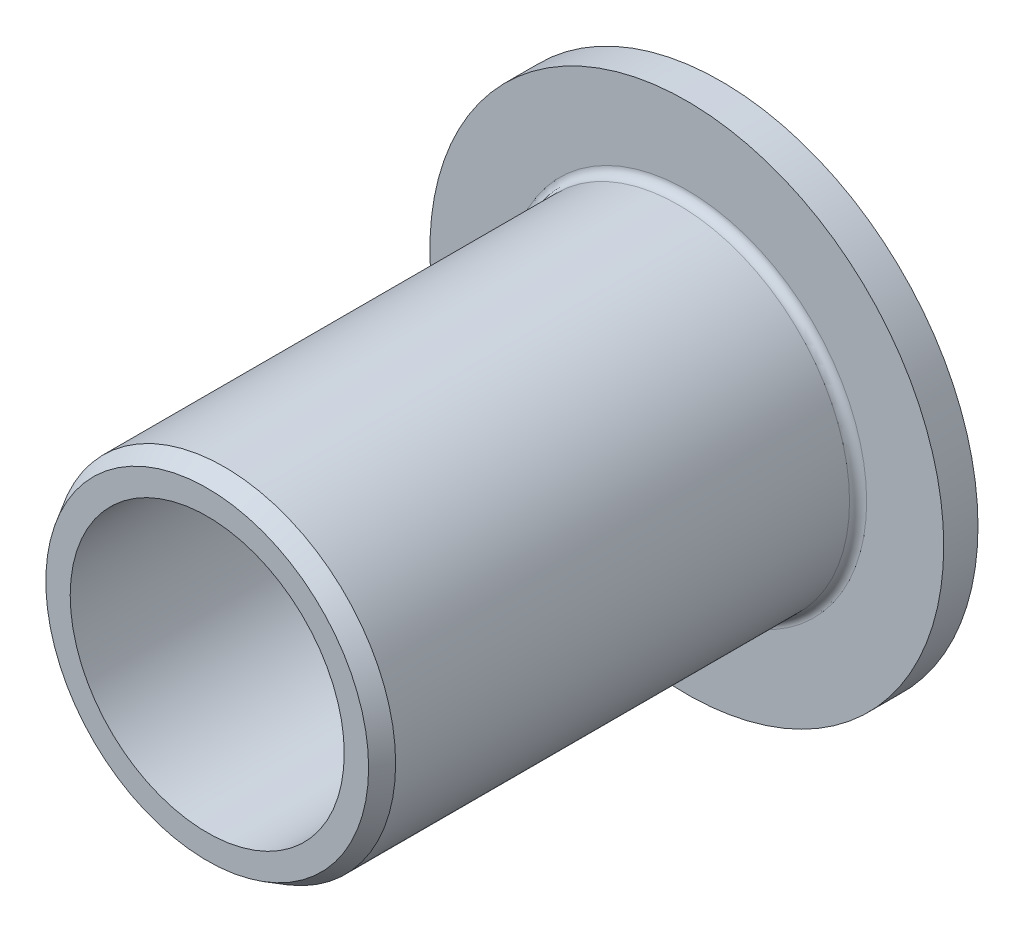
ISO-10303-21;
HEADER;
FILE_DESCRIPTION(('STEP AP214'),'2;1');
FILE_NAME('part.step','',(''),(''),'','','');
FILE_SCHEMA(('AUTOMOTIVE_DESIGN { 1 0 10303 214 1 1 1 1 }'));
ENDSEC;
DATA;
#1=APPLICATION_CONTEXT('core data for automotive mechanical design processes');
#2=APPLICATION_PROTOCOL_DEFINITION('international standard','automotive_design',2000,#1);
#3=PRODUCT_CONTEXT('',#1,'mechanical');
#4=PRODUCT('Part','Part','',(#3));
#5=PRODUCT_RELATED_PRODUCT_CATEGORY('part','',(#4));
#6=PRODUCT_DEFINITION_FORMATION('','',#4);
#7=PRODUCT_DEFINITION_CONTEXT('part definition',#1,'design');
#8=PRODUCT_DEFINITION('design','',#6,#7);
#9=PRODUCT_DEFINITION_SHAPE('','',#8);
#10=(LENGTH_UNIT() NAMED_UNIT(*) SI_UNIT(.MILLI.,.METRE.));
#11=(NAMED_UNIT(*) PLANE_ANGLE_UNIT() SI_UNIT($,.RADIAN.));
#12=(NAMED_UNIT(*) SI_UNIT($,.STERADIAN.) SOLID_ANGLE_UNIT());
#13=UNCERTAINTY_MEASURE_WITH_UNIT(LENGTH_MEASURE(1.E-05),#10,'distance_accuracy_value','');
#14=(GEOMETRIC_REPRESENTATION_CONTEXT(3) GLOBAL_UNCERTAINTY_ASSIGNED_CONTEXT((#13)) GLOBAL_UNIT_ASSIGNED_CONTEXT((#10,
#11,#12)) REPRESENTATION_CONTEXT('',''));
#15=CARTESIAN_POINT('',(0.,0.,0.));
#16=DIRECTION('',(0.,0.,1.));
#17=DIRECTION('',(1.,0.,0.));
#18=AXIS2_PLACEMENT_3D('',#15,#16,#17);
#19=CARTESIAN_POINT('',(0.,0.,0.));
#20=DIRECTION('',(0.,0.,1.));
#21=DIRECTION('',(1.,0.,0.));
#22=AXIS2_PLACEMENT_3D('',#19,#20,#21);
#23=CYLINDRICAL_SURFACE('',#22,5.);
#24=CARTESIAN_POINT('',(0.,0.,1.25));
#25=DIRECTION('',(0.,0.,1.));
#26=DIRECTION('',(1.,0.,0.));
#27=AXIS2_PLACEMENT_3D('',#24,#25,#26);
#28=CIRCLE('',#27,5.);
#29=CARTESIAN_POINT('',(5.,0.,1.25));
#30=VERTEX_POINT('',#29);
#31=EDGE_CURVE('E47',#30,#30,#28,.T.);
#32=ORIENTED_EDGE('',*,*,#31,.T.);
#33=EDGE_LOOP('',(#32));
#34=FACE_BOUND('',#33,.T.);
#35=CARTESIAN_POINT('',(0.,0.,14.4999999999993));
#36=DIRECTION('',(0.,0.,1.));
#37=DIRECTION('',(1.,0.,0.));
#38=AXIS2_PLACEMENT_3D('',#35,#36,#37);
#39=CIRCLE('',#38,5.);
#40=CARTESIAN_POINT('',(5.,0.,14.4999999999993));
#41=VERTEX_POINT('',#40);
#42=EDGE_CURVE('E51',#41,#41,#39,.T.);
#43=ORIENTED_EDGE('',*,*,#42,.F.);
#44=EDGE_LOOP('',(#43));
#45=FACE_BOUND('',#44,.T.);
#46=ADVANCED_FACE('F40',(#34,#45),#23,.T.);
#47=CARTESIAN_POINT('',(0.,0.,15.));
#48=DIRECTION('',(0.,0.,-1.));
#49=DIRECTION('',(-1.,0.,0.));
#50=AXIS2_PLACEMENT_3D('',#47,#48,#49);
#51=CONICAL_SURFACE('',#50,4.71132486540478,0.523598775598299);
#52=ORIENTED_EDGE('',*,*,#42,.T.);
#53=EDGE_LOOP('',(#52));
#54=FACE_BOUND('',#53,.T.);
#55=CARTESIAN_POINT('',(0.,0.,15.));
#56=DIRECTION('',(0.,0.,1.));
#57=DIRECTION('',(1.,0.,0.));
#58=AXIS2_PLACEMENT_3D('',#55,#56,#57);
#59=CIRCLE('',#58,4.71132486540478);
#60=CARTESIAN_POINT('',(4.71132486540478,0.,15.));
#61=VERTEX_POINT('',#60);
#62=EDGE_CURVE('E55',#61,#61,#59,.T.);
#63=ORIENTED_EDGE('',*,*,#62,.F.);
#64=EDGE_LOOP('',(#63));
#65=FACE_BOUND('',#64,.T.);
#66=ADVANCED_FACE('F89',(#54,#65),#51,.T.);
#67=CARTESIAN_POINT('',(4.,0.,15.));
#68=DIRECTION('',(0.,0.,1.));
#69=DIRECTION('',(1.,0.,0.));
#70=AXIS2_PLACEMENT_3D('',#67,#68,#69);
#71=PLANE('',#70);
#72=ORIENTED_EDGE('',*,*,#62,.T.);
#73=EDGE_LOOP('',(#72));
#74=FACE_BOUND('',#73,.T.);
#75=CARTESIAN_POINT('',(0.,0.,15.));
#76=DIRECTION('',(0.,0.,1.));
#77=DIRECTION('',(1.,0.,0.));
#78=AXIS2_PLACEMENT_3D('',#75,#76,#77);
#79=CIRCLE('',#78,4.);
#80=CARTESIAN_POINT('',(4.,0.,15.));
#81=VERTEX_POINT('',#80);
#82=EDGE_CURVE('E60',#81,#81,#79,.T.);
#83=ORIENTED_EDGE('',*,*,#82,.F.);
#84=EDGE_LOOP('',(#83));
#85=FACE_BOUND('',#84,.T.);
#86=ADVANCED_FACE('F93',(#74,#85),#71,.T.);
#87=CARTESIAN_POINT('',(0.,0.,0.));
#88=DIRECTION('',(0.,0.,1.));
#89=DIRECTION('',(1.,0.,0.));
#90=AXIS2_PLACEMENT_3D('',#87,#88,#89);
#91=CYLINDRICAL_SURFACE('',#90,4.);
#92=ORIENTED_EDGE('',*,*,#82,.T.);
#93=EDGE_LOOP('',(#92));
#94=FACE_BOUND('',#93,.T.);
#95=CARTESIAN_POINT('',(0.,0.,0.));
#96=DIRECTION('',(0.,0.,1.));
#97=DIRECTION('',(1.,0.,0.));
#98=AXIS2_PLACEMENT_3D('',#95,#96,#97);
#99=CIRCLE('',#98,4.);
#100=CARTESIAN_POINT('',(4.,0.,0.));
#101=VERTEX_POINT('',#100);
#102=EDGE_CURVE('E63',#101,#101,#99,.T.);
#103=ORIENTED_EDGE('',*,*,#102,.F.);
#104=EDGE_LOOP('',(#103));
#105=FACE_BOUND('',#104,.T.);
#106=ADVANCED_FACE('F86',(#94,#105),#91,.F.);
#107=CARTESIAN_POINT('',(7.5,0.,0.));
#108=DIRECTION('',(0.,0.,-1.));
#109=DIRECTION('',(-1.,0.,0.));
#110=AXIS2_PLACEMENT_3D('',#107,#108,#109);
#111=PLANE('',#110);
#112=ORIENTED_EDGE('',*,*,#102,.T.);
#113=EDGE_LOOP('',(#112));
#114=FACE_BOUND('',#113,.T.);
#115=CARTESIAN_POINT('',(0.,0.,0.));
#116=DIRECTION('',(0.,0.,1.));
#117=DIRECTION('',(1.,0.,0.));
#118=AXIS2_PLACEMENT_3D('',#115,#116,#117);
#119=CIRCLE('',#118,7.5);
#120=CARTESIAN_POINT('',(7.5,0.,0.));
#121=VERTEX_POINT('',#120);
#122=EDGE_CURVE('E66',#121,#121,#119,.T.);
#123=ORIENTED_EDGE('',*,*,#122,.F.);
#124=EDGE_LOOP('',(#123));
#125=FACE_BOUND('',#124,.T.);
#126=ADVANCED_FACE('F77',(#114,#125),#111,.T.);
#127=CARTESIAN_POINT('',(0.,0.,0.));
#128=DIRECTION('',(0.,0.,1.));
#129=DIRECTION('',(1.,0.,0.));
#130=AXIS2_PLACEMENT_3D('',#127,#128,#129);
#131=CYLINDRICAL_SURFACE('',#130,7.5);
#132=ORIENTED_EDGE('',*,*,#122,.T.);
#133=EDGE_LOOP('',(#132));
#134=FACE_BOUND('',#133,.T.);
#135=CARTESIAN_POINT('',(0.,0.,1.));
#136=DIRECTION('',(0.,0.,1.));
#137=DIRECTION('',(1.,0.,0.));
#138=AXIS2_PLACEMENT_3D('',#135,#136,#137);
#139=CIRCLE('',#138,7.5);
#140=CARTESIAN_POINT('',(7.5,0.,1.));
#141=VERTEX_POINT('',#140);
#142=EDGE_CURVE('E69',#141,#141,#139,.T.);
#143=ORIENTED_EDGE('',*,*,#142,.F.);
#144=EDGE_LOOP('',(#143));
#145=FACE_BOUND('',#144,.T.);
#146=ADVANCED_FACE('F75',(#134,#145),#131,.T.);
#147=CARTESIAN_POINT('',(5.,0.,1.));
#148=DIRECTION('',(0.,0.,1.));
#149=DIRECTION('',(1.,0.,0.));
#150=AXIS2_PLACEMENT_3D('',#147,#148,#149);
#151=PLANE('',#150);
#152=CARTESIAN_POINT('',(0.,0.,1.));
#153=DIRECTION('',(0.,0.,1.));
#154=DIRECTION('',(1.,0.,0.));
#155=AXIS2_PLACEMENT_3D('',#152,#153,#154);
#156=CIRCLE('',#155,5.25);
#157=CARTESIAN_POINT('',(5.25,0.,1.));
#158=VERTEX_POINT('',#157);
#159=EDGE_CURVE('E10',#158,#158,#156,.F.);
#160=ORIENTED_EDGE('',*,*,#159,.T.);
#161=EDGE_LOOP('',(#160));
#162=FACE_BOUND('',#161,.T.);
#163=ORIENTED_EDGE('',*,*,#142,.T.);
#164=EDGE_LOOP('',(#163));
#165=FACE_BOUND('',#164,.T.);
#166=ADVANCED_FACE('F73',(#162,#165),#151,.T.);
#167=CARTESIAN_POINT('',(0.,0.,1.25));
#168=DIRECTION('',(0.,0.,1.));
#169=DIRECTION('',(1.,0.,0.));
#170=AXIS2_PLACEMENT_3D('',#167,#168,#169);
#171=TOROIDAL_SURFACE('',#170,5.25,0.25);
#172=ORIENTED_EDGE('',*,*,#159,.F.);
#173=EDGE_LOOP('',(#172));
#174=FACE_BOUND('',#173,.T.);
#175=ORIENTED_EDGE('',*,*,#31,.F.);
#176=EDGE_LOOP('',(#175));
#177=FACE_BOUND('',#176,.T.);
#178=ADVANCED_FACE('F42',(#174,#177),#171,.F.);
#179=CLOSED_SHELL('',(#46,#66,#86,#106,#126,#146,#166,#178));
#180=MANIFOLD_SOLID_BREP('B2',#179);
#181=ADVANCED_BREP_SHAPE_REPRESENTATION('',(#18,#180),#14);
#182=SHAPE_DEFINITION_REPRESENTATION(#9,#181);
ENDSEC;
END-ISO-10303-21;
